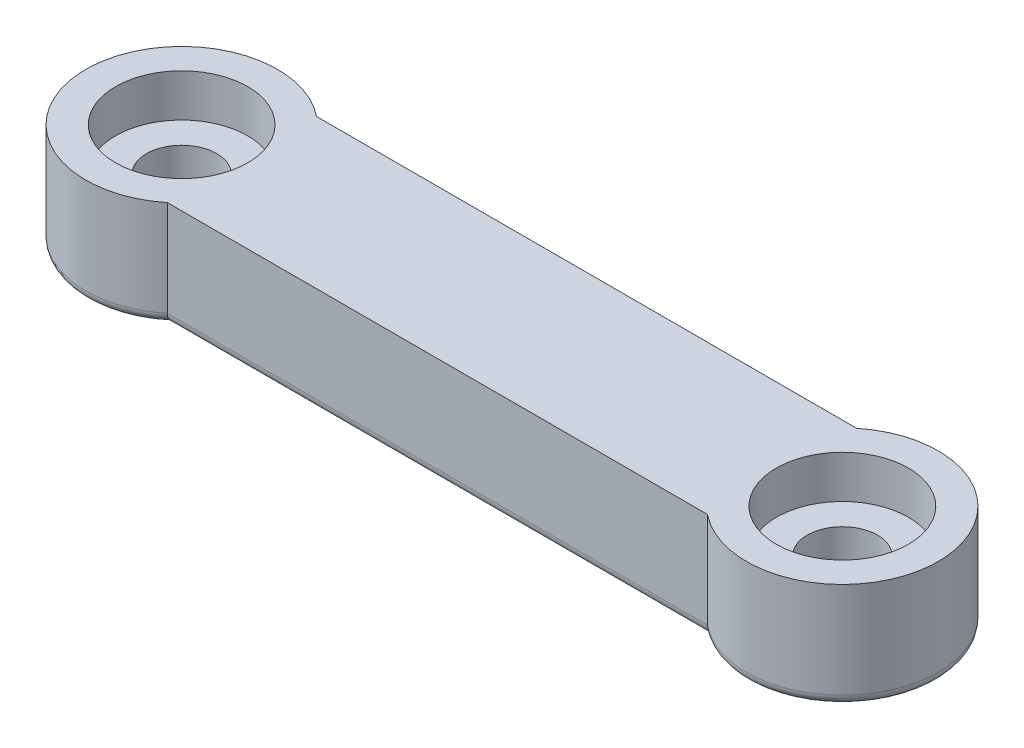
ISO-10303-21;
HEADER;
FILE_DESCRIPTION(('STEP AP214'),'2;1');
FILE_NAME('part.step','',(''),(''),'','','');
FILE_SCHEMA(('AUTOMOTIVE_DESIGN { 1 0 10303 214 1 1 1 1 }'));
ENDSEC;
DATA;
#1=APPLICATION_CONTEXT('core data for automotive mechanical design processes');
#2=APPLICATION_PROTOCOL_DEFINITION('international standard','automotive_design',2000,#1);
#3=PRODUCT_CONTEXT('',#1,'mechanical');
#4=PRODUCT('Part','Part','',(#3));
#5=PRODUCT_RELATED_PRODUCT_CATEGORY('part','',(#4));
#6=PRODUCT_DEFINITION_FORMATION('','',#4);
#7=PRODUCT_DEFINITION_CONTEXT('part definition',#1,'design');
#8=PRODUCT_DEFINITION('design','',#6,#7);
#9=PRODUCT_DEFINITION_SHAPE('','',#8);
#10=(LENGTH_UNIT() NAMED_UNIT(*) SI_UNIT(.MILLI.,.METRE.));
#11=(NAMED_UNIT(*) PLANE_ANGLE_UNIT() SI_UNIT($,.RADIAN.));
#12=(NAMED_UNIT(*) SI_UNIT($,.STERADIAN.) SOLID_ANGLE_UNIT());
#13=UNCERTAINTY_MEASURE_WITH_UNIT(LENGTH_MEASURE(1.E-05),#10,'distance_accuracy_value','');
#14=(GEOMETRIC_REPRESENTATION_CONTEXT(3) GLOBAL_UNCERTAINTY_ASSIGNED_CONTEXT((#13)) GLOBAL_UNIT_ASSIGNED_CONTEXT((#10,
#11,#12)) REPRESENTATION_CONTEXT('',''));
#15=CARTESIAN_POINT('',(0.,0.,0.));
#16=DIRECTION('',(0.,0.,1.));
#17=DIRECTION('',(1.,0.,0.));
#18=AXIS2_PLACEMENT_3D('',#15,#16,#17);
#19=CARTESIAN_POINT('',(31.,0.,-3.5));
#20=DIRECTION('',(0.,1.,0.));
#21=DIRECTION('',(0.,0.,1.));
#22=AXIS2_PLACEMENT_3D('',#19,#20,#21);
#23=CYLINDRICAL_SURFACE('',#22,1.65);
#24=CARTESIAN_POINT('',(31.,0.,-3.5));
#25=DIRECTION('',(0.,1.,0.));
#26=DIRECTION('',(0.,0.,1.));
#27=AXIS2_PLACEMENT_3D('',#24,#25,#26);
#28=CIRCLE('',#27,1.65);
#29=CARTESIAN_POINT('',(31.,0.,-1.85));
#30=VERTEX_POINT('',#29);
#31=EDGE_CURVE('E123',#30,#30,#28,.T.);
#32=ORIENTED_EDGE('',*,*,#31,.F.);
#33=EDGE_LOOP('',(#32));
#34=FACE_BOUND('',#33,.T.);
#35=CARTESIAN_POINT('',(31.,3.,-3.5));
#36=DIRECTION('',(0.,1.,0.));
#37=DIRECTION('',(0.,0.,1.));
#38=AXIS2_PLACEMENT_3D('',#35,#36,#37);
#39=CIRCLE('',#38,1.65);
#40=CARTESIAN_POINT('',(31.,3.,-1.85));
#41=VERTEX_POINT('',#40);
#42=EDGE_CURVE('E125',#41,#41,#39,.F.);
#43=ORIENTED_EDGE('',*,*,#42,.F.);
#44=EDGE_LOOP('',(#43));
#45=FACE_BOUND('',#44,.T.);
#46=ADVANCED_FACE('F34',(#34,#45),#23,.F.);
#47=CARTESIAN_POINT('',(0.,0.,-3.5));
#48=DIRECTION('',(0.,1.,0.));
#49=DIRECTION('',(0.,0.,1.));
#50=AXIS2_PLACEMENT_3D('',#47,#48,#49);
#51=CYLINDRICAL_SURFACE('',#50,1.65);
#52=CARTESIAN_POINT('',(0.,0.,-3.5));
#53=DIRECTION('',(0.,1.,0.));
#54=DIRECTION('',(0.,0.,1.));
#55=AXIS2_PLACEMENT_3D('',#52,#53,#54);
#56=CIRCLE('',#55,1.65);
#57=CARTESIAN_POINT('',(0.,0.,-1.85));
#58=VERTEX_POINT('',#57);
#59=EDGE_CURVE('E108',#58,#58,#56,.T.);
#60=ORIENTED_EDGE('',*,*,#59,.F.);
#61=EDGE_LOOP('',(#60));
#62=FACE_BOUND('',#61,.T.);
#63=CARTESIAN_POINT('',(0.,3.,-3.5));
#64=DIRECTION('',(0.,1.,0.));
#65=DIRECTION('',(0.,0.,1.));
#66=AXIS2_PLACEMENT_3D('',#63,#64,#65);
#67=CIRCLE('',#66,1.65);
#68=CARTESIAN_POINT('',(0.,3.,-1.85));
#69=VERTEX_POINT('',#68);
#70=EDGE_CURVE('E120',#69,#69,#67,.F.);
#71=ORIENTED_EDGE('',*,*,#70,.F.);
#72=EDGE_LOOP('',(#71));
#73=FACE_BOUND('',#72,.T.);
#74=ADVANCED_FACE('F234',(#62,#73),#51,.F.);
#75=CARTESIAN_POINT('',(0.,5.,0.));
#76=DIRECTION('',(0.,0.,-1.));
#77=DIRECTION('',(-1.,0.,0.));
#78=AXIS2_PLACEMENT_3D('',#75,#76,#77);
#79=PLANE('',#78);
#80=DIRECTION('',(0.,1.,0.));
#81=VECTOR('',#80,1.);
#82=CARTESIAN_POINT('',(2.82842712474619,0.,0.));
#83=LINE('',#82,#81);
#84=CARTESIAN_POINT('',(2.82842712474619,5.,0.));
#85=VERTEX_POINT('',#84);
#86=CARTESIAN_POINT('',(2.82842712474619,0.5,0.));
#87=VERTEX_POINT('',#86);
#88=EDGE_CURVE('E90',#85,#87,#83,.F.);
#89=ORIENTED_EDGE('',*,*,#88,.T.);
#90=DIRECTION('',(1.,0.,0.));
#91=VECTOR('',#90,1.);
#92=CARTESIAN_POINT('',(28.1715728752538,0.5,0.));
#93=LINE('',#92,#91);
#94=CARTESIAN_POINT('',(28.1715728752538,0.5,0.));
#95=VERTEX_POINT('',#94);
#96=EDGE_CURVE('E11',#87,#95,#93,.T.);
#97=ORIENTED_EDGE('',*,*,#96,.T.);
#98=DIRECTION('',(0.,1.,0.));
#99=VECTOR('',#98,1.);
#100=CARTESIAN_POINT('',(28.1715728752538,0.,0.));
#101=LINE('',#100,#99);
#102=CARTESIAN_POINT('',(28.1715728752538,5.,0.));
#103=VERTEX_POINT('',#102);
#104=EDGE_CURVE('E112',#95,#103,#101,.T.);
#105=ORIENTED_EDGE('',*,*,#104,.T.);
#106=DIRECTION('',(1.,0.,0.));
#107=VECTOR('',#106,1.);
#108=CARTESIAN_POINT('',(0.,5.,0.));
#109=LINE('',#108,#107);
#110=EDGE_CURVE('E104',#85,#103,#109,.T.);
#111=ORIENTED_EDGE('',*,*,#110,.F.);
#112=EDGE_LOOP('',(#89,#97,#105,#111));
#113=FACE_BOUND('',#112,.T.);
#114=ADVANCED_FACE('F110',(#113),#79,.F.);
#115=CARTESIAN_POINT('',(0.,5.,-7.));
#116=DIRECTION('',(0.,0.,1.));
#117=DIRECTION('',(1.,0.,0.));
#118=AXIS2_PLACEMENT_3D('',#115,#116,#117);
#119=PLANE('',#118);
#120=DIRECTION('',(0.,1.,0.));
#121=VECTOR('',#120,1.);
#122=CARTESIAN_POINT('',(28.1715728752538,0.,-7.));
#123=LINE('',#122,#121);
#124=CARTESIAN_POINT('',(28.1715728752538,5.,-7.));
#125=VERTEX_POINT('',#124);
#126=CARTESIAN_POINT('',(28.1715728752538,0.5,-7.));
#127=VERTEX_POINT('',#126);
#128=EDGE_CURVE('E116',#125,#127,#123,.F.);
#129=ORIENTED_EDGE('',*,*,#128,.T.);
#130=DIRECTION('',(-1.,0.,0.));
#131=VECTOR('',#130,1.);
#132=CARTESIAN_POINT('',(2.82842712474619,0.5,-7.));
#133=LINE('',#132,#131);
#134=CARTESIAN_POINT('',(2.82842712474619,0.5,-7.));
#135=VERTEX_POINT('',#134);
#136=EDGE_CURVE('E62',#127,#135,#133,.T.);
#137=ORIENTED_EDGE('',*,*,#136,.T.);
#138=DIRECTION('',(0.,1.,0.));
#139=VECTOR('',#138,1.);
#140=CARTESIAN_POINT('',(2.82842712474619,0.,-7.));
#141=LINE('',#140,#139);
#142=CARTESIAN_POINT('',(2.82842712474619,5.,-7.));
#143=VERTEX_POINT('',#142);
#144=EDGE_CURVE('E99',#135,#143,#141,.T.);
#145=ORIENTED_EDGE('',*,*,#144,.T.);
#146=DIRECTION('',(-1.,0.,0.));
#147=VECTOR('',#146,1.);
#148=CARTESIAN_POINT('',(0.,5.,-7.));
#149=LINE('',#148,#147);
#150=EDGE_CURVE('E107',#125,#143,#149,.T.);
#151=ORIENTED_EDGE('',*,*,#150,.F.);
#152=EDGE_LOOP('',(#129,#137,#145,#151));
#153=FACE_BOUND('',#152,.T.);
#154=ADVANCED_FACE('F188',(#153),#119,.F.);
#155=CARTESIAN_POINT('',(0.,5.,0.));
#156=DIRECTION('',(0.,-1.,0.));
#157=DIRECTION('',(0.,0.,-1.));
#158=AXIS2_PLACEMENT_3D('',#155,#156,#157);
#159=PLANE('',#158);
#160=CARTESIAN_POINT('',(31.,5.,-3.5));
#161=DIRECTION('',(0.,1.,0.));
#162=DIRECTION('',(0.,0.,1.));
#163=AXIS2_PLACEMENT_3D('',#160,#161,#162);
#164=CIRCLE('',#163,3.1);
#165=CARTESIAN_POINT('',(31.,5.,-0.399999999999998));
#166=VERTEX_POINT('',#165);
#167=EDGE_CURVE('E172',#166,#166,#164,.T.);
#168=ORIENTED_EDGE('',*,*,#167,.F.);
#169=EDGE_LOOP('',(#168));
#170=FACE_BOUND('',#169,.T.);
#171=CARTESIAN_POINT('',(0.,5.,-3.5));
#172=DIRECTION('',(0.,1.,0.));
#173=DIRECTION('',(0.,0.,1.));
#174=AXIS2_PLACEMENT_3D('',#171,#172,#173);
#175=CIRCLE('',#174,3.1);
#176=CARTESIAN_POINT('',(0.,5.,-0.4));
#177=VERTEX_POINT('',#176);
#178=EDGE_CURVE('E128',#177,#177,#175,.T.);
#179=ORIENTED_EDGE('',*,*,#178,.F.);
#180=EDGE_LOOP('',(#179));
#181=FACE_BOUND('',#180,.T.);
#182=CARTESIAN_POINT('',(0.,5.,-3.5));
#183=DIRECTION('',(0.,1.,0.));
#184=DIRECTION('',(0.,0.,1.));
#185=AXIS2_PLACEMENT_3D('',#182,#183,#184);
#186=CIRCLE('',#185,4.5);
#187=EDGE_CURVE('E93',#143,#85,#186,.T.);
#188=ORIENTED_EDGE('',*,*,#187,.T.);
#189=ORIENTED_EDGE('',*,*,#110,.T.);
#190=CARTESIAN_POINT('',(31.,5.,-3.5));
#191=DIRECTION('',(0.,1.,0.));
#192=DIRECTION('',(0.,0.,1.));
#193=AXIS2_PLACEMENT_3D('',#190,#191,#192);
#194=CIRCLE('',#193,4.5);
#195=EDGE_CURVE('E98',#103,#125,#194,.T.);
#196=ORIENTED_EDGE('',*,*,#195,.T.);
#197=ORIENTED_EDGE('',*,*,#150,.T.);
#198=EDGE_LOOP('',(#188,#189,#196,#197));
#199=FACE_BOUND('',#198,.T.);
#200=ADVANCED_FACE('F103',(#170,#181,#199),#159,.F.);
#201=CARTESIAN_POINT('',(0.,0.,0.));
#202=DIRECTION('',(0.,-1.,0.));
#203=DIRECTION('',(0.,0.,-1.));
#204=AXIS2_PLACEMENT_3D('',#201,#202,#203);
#205=PLANE('',#204);
#206=DIRECTION('',(-1.,0.,0.));
#207=VECTOR('',#206,1.);
#208=CARTESIAN_POINT('',(28.1715728752538,0.,-6.5));
#209=LINE('',#208,#207);
#210=CARTESIAN_POINT('',(2.6457513110654,0.,-6.49999999999928));
#211=VERTEX_POINT('',#210);
#212=CARTESIAN_POINT('',(28.3542486889346,0.,-6.5));
#213=VERTEX_POINT('',#212);
#214=EDGE_CURVE('E136',#211,#213,#209,.F.);
#215=ORIENTED_EDGE('',*,*,#214,.T.);
#216=CARTESIAN_POINT('',(31.,0.,-3.5));
#217=DIRECTION('',(0.,-1.,0.));
#218=DIRECTION('',(0.,0.,-1.));
#219=AXIS2_PLACEMENT_3D('',#216,#217,#218);
#220=CIRCLE('',#219,4.);
#221=CARTESIAN_POINT('',(28.3542486889346,0.,-0.5));
#222=VERTEX_POINT('',#221);
#223=EDGE_CURVE('E138',#213,#222,#220,.T.);
#224=ORIENTED_EDGE('',*,*,#223,.T.);
#225=DIRECTION('',(1.,0.,0.));
#226=VECTOR('',#225,1.);
#227=CARTESIAN_POINT('',(2.82842712474619,0.,-0.5));
#228=LINE('',#227,#226);
#229=CARTESIAN_POINT('',(2.6457513110654,0.,-0.5));
#230=VERTEX_POINT('',#229);
#231=EDGE_CURVE('E132',#222,#230,#228,.F.);
#232=ORIENTED_EDGE('',*,*,#231,.T.);
#233=CARTESIAN_POINT('',(0.,0.,-3.5));
#234=DIRECTION('',(0.,-1.,0.));
#235=DIRECTION('',(0.,0.,-1.));
#236=AXIS2_PLACEMENT_3D('',#233,#234,#235);
#237=CIRCLE('',#236,4.);
#238=EDGE_CURVE('E134',#230,#211,#237,.T.);
#239=ORIENTED_EDGE('',*,*,#238,.T.);
#240=EDGE_LOOP('',(#215,#224,#232,#239));
#241=FACE_BOUND('',#240,.T.);
#242=ORIENTED_EDGE('',*,*,#31,.T.);
#243=EDGE_LOOP('',(#242));
#244=FACE_BOUND('',#243,.T.);
#245=ORIENTED_EDGE('',*,*,#59,.T.);
#246=EDGE_LOOP('',(#245));
#247=FACE_BOUND('',#246,.T.);
#248=ADVANCED_FACE('F183',(#241,#244,#247),#205,.T.);
#249=CARTESIAN_POINT('',(31.,0.,-3.5));
#250=DIRECTION('',(0.,1.,0.));
#251=DIRECTION('',(0.,0.,1.));
#252=AXIS2_PLACEMENT_3D('',#249,#250,#251);
#253=CYLINDRICAL_SURFACE('',#252,4.5);
#254=ORIENTED_EDGE('',*,*,#104,.F.);
#255=CARTESIAN_POINT('',(31.,0.5,-3.5));
#256=DIRECTION('',(0.,-1.,0.));
#257=DIRECTION('',(0.,0.,-1.));
#258=AXIS2_PLACEMENT_3D('',#255,#256,#257);
#259=CIRCLE('',#258,4.5);
#260=EDGE_CURVE('E114',#95,#127,#259,.F.);
#261=ORIENTED_EDGE('',*,*,#260,.T.);
#262=ORIENTED_EDGE('',*,*,#128,.F.);
#263=ORIENTED_EDGE('',*,*,#195,.F.);
#264=EDGE_LOOP('',(#254,#261,#262,#263));
#265=FACE_BOUND('',#264,.T.);
#266=ADVANCED_FACE('F187',(#265),#253,.T.);
#267=CARTESIAN_POINT('',(0.,0.,-3.5));
#268=DIRECTION('',(0.,1.,0.));
#269=DIRECTION('',(0.,0.,1.));
#270=AXIS2_PLACEMENT_3D('',#267,#268,#269);
#271=CYLINDRICAL_SURFACE('',#270,4.5);
#272=ORIENTED_EDGE('',*,*,#144,.F.);
#273=CARTESIAN_POINT('',(0.,0.5,-3.5));
#274=DIRECTION('',(0.,-1.,0.));
#275=DIRECTION('',(0.,0.,-1.));
#276=AXIS2_PLACEMENT_3D('',#273,#274,#275);
#277=CIRCLE('',#276,4.5);
#278=EDGE_CURVE('E47',#135,#87,#277,.F.);
#279=ORIENTED_EDGE('',*,*,#278,.T.);
#280=ORIENTED_EDGE('',*,*,#88,.F.);
#281=ORIENTED_EDGE('',*,*,#187,.F.);
#282=EDGE_LOOP('',(#272,#279,#280,#281));
#283=FACE_BOUND('',#282,.T.);
#284=ADVANCED_FACE('F92',(#283),#271,.T.);
#285=CARTESIAN_POINT('',(0.,3.,-3.5));
#286=DIRECTION('',(0.,1.,0.));
#287=DIRECTION('',(0.,0.,1.));
#288=AXIS2_PLACEMENT_3D('',#285,#286,#287);
#289=PLANE('',#288);
#290=CARTESIAN_POINT('',(0.,3.,-3.5));
#291=DIRECTION('',(0.,1.,0.));
#292=DIRECTION('',(0.,0.,1.));
#293=AXIS2_PLACEMENT_3D('',#290,#291,#292);
#294=CIRCLE('',#293,3.1);
#295=CARTESIAN_POINT('',(0.,3.,-0.4));
#296=VERTEX_POINT('',#295);
#297=EDGE_CURVE('E124',#296,#296,#294,.T.);
#298=ORIENTED_EDGE('',*,*,#297,.T.);
#299=EDGE_LOOP('',(#298));
#300=FACE_BOUND('',#299,.T.);
#301=ORIENTED_EDGE('',*,*,#70,.T.);
#302=EDGE_LOOP('',(#301));
#303=FACE_BOUND('',#302,.T.);
#304=ADVANCED_FACE('F221',(#300,#303),#289,.T.);
#305=CARTESIAN_POINT('',(0.,3.,-3.5));
#306=DIRECTION('',(0.,1.,0.));
#307=DIRECTION('',(0.,0.,1.));
#308=AXIS2_PLACEMENT_3D('',#305,#306,#307);
#309=CYLINDRICAL_SURFACE('',#308,3.1);
#310=ORIENTED_EDGE('',*,*,#297,.F.);
#311=EDGE_LOOP('',(#310));
#312=FACE_BOUND('',#311,.T.);
#313=ORIENTED_EDGE('',*,*,#178,.T.);
#314=EDGE_LOOP('',(#313));
#315=FACE_BOUND('',#314,.T.);
#316=ADVANCED_FACE('F219',(#312,#315),#309,.F.);
#317=CARTESIAN_POINT('',(31.,3.,-3.5));
#318=DIRECTION('',(0.,1.,0.));
#319=DIRECTION('',(0.,0.,1.));
#320=AXIS2_PLACEMENT_3D('',#317,#318,#319);
#321=PLANE('',#320);
#322=CARTESIAN_POINT('',(31.,3.,-3.5));
#323=DIRECTION('',(0.,1.,0.));
#324=DIRECTION('',(0.,0.,1.));
#325=AXIS2_PLACEMENT_3D('',#322,#323,#324);
#326=CIRCLE('',#325,3.1);
#327=CARTESIAN_POINT('',(31.,3.,-0.399999999999998));
#328=VERTEX_POINT('',#327);
#329=EDGE_CURVE('E129',#328,#328,#326,.T.);
#330=ORIENTED_EDGE('',*,*,#329,.T.);
#331=EDGE_LOOP('',(#330));
#332=FACE_BOUND('',#331,.T.);
#333=ORIENTED_EDGE('',*,*,#42,.T.);
#334=EDGE_LOOP('',(#333));
#335=FACE_BOUND('',#334,.T.);
#336=ADVANCED_FACE('F205',(#332,#335),#321,.T.);
#337=CARTESIAN_POINT('',(31.,3.,-3.5));
#338=DIRECTION('',(0.,1.,0.));
#339=DIRECTION('',(0.,0.,1.));
#340=AXIS2_PLACEMENT_3D('',#337,#338,#339);
#341=CYLINDRICAL_SURFACE('',#340,3.1);
#342=ORIENTED_EDGE('',*,*,#329,.F.);
#343=EDGE_LOOP('',(#342));
#344=FACE_BOUND('',#343,.T.);
#345=ORIENTED_EDGE('',*,*,#167,.T.);
#346=EDGE_LOOP('',(#345));
#347=FACE_BOUND('',#346,.T.);
#348=ADVANCED_FACE('F208',(#344,#347),#341,.F.);
#349=CARTESIAN_POINT('',(0.,0.5,-3.5));
#350=DIRECTION('',(0.,-1.,0.));
#351=DIRECTION('',(0.,0.,-1.));
#352=AXIS2_PLACEMENT_3D('',#349,#350,#351);
#353=TOROIDAL_SURFACE('',#352,4.,0.5);
#354=CARTESIAN_POINT('',(2.82842712474619,0.5,-7.));
#355=CARTESIAN_POINT('',(2.82843602799302,0.473049536404365,-7.00002868294445));
#356=CARTESIAN_POINT('',(2.8276574089572,0.446115084682407,-6.99782295534803));
#357=CARTESIAN_POINT('',(2.8245942402374,0.393085795099896,-6.98916421891165));
#358=CARTESIAN_POINT('',(2.82231308711431,0.366989202429285,-6.98272078967865));
#359=CARTESIAN_POINT('',(2.81631357602138,0.316316504852455,-6.96580687186099));
#360=CARTESIAN_POINT('',(2.81259529955809,0.291740313808231,-6.9553366116585));
#361=CARTESIAN_POINT('',(2.80384040511152,0.244741690234721,-6.93075089381794));
#362=CARTESIAN_POINT('',(2.79880351482553,0.222319703872226,-6.91663468327445));
#363=CARTESIAN_POINT('',(2.78742766966984,0.179678117229886,-6.88486002566356));
#364=CARTESIAN_POINT('',(2.78106140392219,0.1595211174005,-6.86712749920604));
#365=CARTESIAN_POINT('',(2.76727851511785,0.122455483556791,-6.82889146510103));
#366=CARTESIAN_POINT('',(2.75986154758605,0.10554791917913,-6.80838704878397));
#367=CARTESIAN_POINT('',(2.74373995270562,0.0744814010452313,-6.76402027642532));
#368=CARTESIAN_POINT('',(2.73498724818534,0.0605217970409316,-6.74003598010742));
#369=CARTESIAN_POINT('',(2.71675002597386,0.0368207820131519,-6.69032384652976));
#370=CARTESIAN_POINT('',(2.70726542771733,0.027079836153359,-6.66459581736159));
#371=CARTESIAN_POINT('',(2.68947531477602,0.0132602486706095,-6.61660616410762));
#372=CARTESIAN_POINT('',(2.68124732453821,0.00849616175480383,-6.59450877024797));
#373=CARTESIAN_POINT('',(2.66458823772384,0.00199749708245064,-6.5499806942288));
#374=CARTESIAN_POINT('',(2.65615755215858,0.000257239524026848,-6.52755071691309));
#375=CARTESIAN_POINT('',(2.64704715811007,8.79896774300487E-06,-6.50342911469581));
#376=CARTESIAN_POINT('',(2.64639931120109,-2.17634650854478E-08,-6.50171444237487));
#377=CARTESIAN_POINT('',(2.64575131106459,0.,-6.5));
#378=B_SPLINE_CURVE_WITH_KNOTS('',3,(#354,#355,#356,#357,#358,#359,#360,#361,#362,#363,#364,
#365,#366,#367,#368,#369,#370,#371,#372,#373,#374,#375,#376,#377),.UNSPECIFIED.,.F.,.F.,(4,2,2,
2,2,2,2,2,2,2,2,4),(0.,0.0807254543750162,0.161269047839428,0.241808073938378,0.322363745030777,
0.404774297128624,0.487211930525085,0.57413039313318,0.661058437229921,0.733045942168927,
0.804898082802622,0.810396978914769),.UNSPECIFIED.);
#379=EDGE_CURVE('E164',#211,#135,#378,.F.);
#380=ORIENTED_EDGE('',*,*,#379,.F.);
#381=ORIENTED_EDGE('',*,*,#238,.F.);
#382=CARTESIAN_POINT('',(2.82842712474619,0.5,0.));
#383=CARTESIAN_POINT('',(2.82843602799302,0.473049536404365,2.86829444501018E-05));
#384=CARTESIAN_POINT('',(2.8276574089572,0.446115084682407,-0.0021770446519677));
#385=CARTESIAN_POINT('',(2.8245942402374,0.393085795099896,-0.0108357810883533));
#386=CARTESIAN_POINT('',(2.82231308711431,0.366989202429286,-0.0172792103213454));
#387=CARTESIAN_POINT('',(2.81631357602138,0.316316504852455,-0.034193128139006));
#388=CARTESIAN_POINT('',(2.81259529955809,0.291740313808231,-0.0446633883415046));
#389=CARTESIAN_POINT('',(2.80384040511152,0.244741690234721,-0.0692491061820648));
#390=CARTESIAN_POINT('',(2.79880351482553,0.222319703872227,-0.0833653167255496));
#391=CARTESIAN_POINT('',(2.78742766966984,0.179678117229886,-0.115139974336437));
#392=CARTESIAN_POINT('',(2.78106140392219,0.1595211174005,-0.132872500793958));
#393=CARTESIAN_POINT('',(2.76727851511785,0.122455483556791,-0.171108534898966));
#394=CARTESIAN_POINT('',(2.75986154758606,0.10554791917913,-0.191612951216035));
#395=CARTESIAN_POINT('',(2.74373995270562,0.0744814010452313,-0.235979723574679));
#396=CARTESIAN_POINT('',(2.73498724818534,0.0605217970409318,-0.259964019892585));
#397=CARTESIAN_POINT('',(2.71675002597386,0.036820782013152,-0.309676153470239));
#398=CARTESIAN_POINT('',(2.70726542771733,0.027079836153359,-0.335404182638409));
#399=CARTESIAN_POINT('',(2.68947531477602,0.0132602486706095,-0.383393835892381));
#400=CARTESIAN_POINT('',(2.68124732453822,0.0084961617548038,-0.405491229752035));
#401=CARTESIAN_POINT('',(2.66458823772384,0.00199749708245047,-0.450019305771202));
#402=CARTESIAN_POINT('',(2.65615755215858,0.000257239524026551,-0.472449283086906));
#403=CARTESIAN_POINT('',(2.64704715811007,8.79896774296242E-06,-0.496570885304187));
#404=CARTESIAN_POINT('',(2.64639931120109,-2.17634651077196E-08,-0.498285557625131));
#405=CARTESIAN_POINT('',(2.64575131106459,0.,-0.5));
#406=B_SPLINE_CURVE_WITH_KNOTS('',3,(#382,#383,#384,#385,#386,#387,#388,#389,#390,#391,#392,
#393,#394,#395,#396,#397,#398,#399,#400,#401,#402,#403,#404,#405),.UNSPECIFIED.,.F.,.F.,(4,2,2,
2,2,2,2,2,2,2,2,4),(0.,0.0807254543750162,0.161269047839428,0.241808073938378,0.322363745030777,
0.404774297128624,0.487211930525085,0.574130393133179,0.661058437229921,0.733045942168927,
0.804898082802622,0.810396978914769),.UNSPECIFIED.);
#407=EDGE_CURVE('E39',#87,#230,#406,.T.);
#408=ORIENTED_EDGE('',*,*,#407,.F.);
#409=ORIENTED_EDGE('',*,*,#278,.F.);
#410=EDGE_LOOP('',(#380,#381,#408,#409));
#411=FACE_BOUND('',#410,.T.);
#412=ADVANCED_FACE('F36',(#411),#353,.T.);
#413=CARTESIAN_POINT('',(0.,0.5,-0.5));
#414=DIRECTION('',(-1.,0.,0.));
#415=DIRECTION('',(0.,0.,1.));
#416=AXIS2_PLACEMENT_3D('',#413,#414,#415);
#417=CYLINDRICAL_SURFACE('',#416,0.5);
#418=ORIENTED_EDGE('',*,*,#407,.T.);
#419=ORIENTED_EDGE('',*,*,#231,.F.);
#420=CARTESIAN_POINT('',(28.1715728752538,0.5,0.));
#421=CARTESIAN_POINT('',(28.171563972007,0.473049536404365,2.86829444499853E-05));
#422=CARTESIAN_POINT('',(28.1723425910428,0.446115084682407,-0.00217704465196784));
#423=CARTESIAN_POINT('',(28.1754057597626,0.393085795099895,-0.0108357810883534));
#424=CARTESIAN_POINT('',(28.1776869128857,0.366989202429285,-0.0172792103213455));
#425=CARTESIAN_POINT('',(28.1836864239786,0.316316504852454,-0.034193128139006));
#426=CARTESIAN_POINT('',(28.1874047004419,0.291740313808231,-0.0446633883415048));
#427=CARTESIAN_POINT('',(28.1961595948885,0.244741690234721,-0.069249106182065));
#428=CARTESIAN_POINT('',(28.2011964851745,0.222319703872226,-0.0833653167255497));
#429=CARTESIAN_POINT('',(28.2125723303302,0.179678117229885,-0.115139974336437));
#430=CARTESIAN_POINT('',(28.2189385960778,0.1595211174005,-0.132872500793958));
#431=CARTESIAN_POINT('',(28.2327214848821,0.12245548355679,-0.171108534898967));
#432=CARTESIAN_POINT('',(28.2401384524139,0.105547919179129,-0.191612951216035));
#433=CARTESIAN_POINT('',(28.2562600472944,0.0744814010452313,-0.235979723574679));
#434=CARTESIAN_POINT('',(28.2650127518147,0.0605217970409318,-0.259964019892585));
#435=CARTESIAN_POINT('',(28.2832499740261,0.0368207820131519,-0.30967615347024));
#436=CARTESIAN_POINT('',(28.2927345722827,0.0270798361533588,-0.335404182638412));
#437=CARTESIAN_POINT('',(28.310524685224,0.0132602486706092,-0.38339383589238));
#438=CARTESIAN_POINT('',(28.3187526754618,0.00849616175480352,-0.40549122975203));
#439=CARTESIAN_POINT('',(28.3354117622761,0.0019974970824503,-0.45001930577121));
#440=CARTESIAN_POINT('',(28.3438424478414,0.000257239524026353,-0.472449283086933));
#441=CARTESIAN_POINT('',(28.3529528418899,8.79896774293987E-06,-0.496570885304192));
#442=CARTESIAN_POINT('',(28.3536006887989,-2.176346511703E-08,-0.498285557625134));
#443=CARTESIAN_POINT('',(28.3542486889354,0.,-0.5));
#444=B_SPLINE_CURVE_WITH_KNOTS('',3,(#420,#421,#422,#423,#424,#425,#426,#427,#428,#429,#430,
#431,#432,#433,#434,#435,#436,#437,#438,#439,#440,#441,#442,#443),.UNSPECIFIED.,.F.,.F.,(4,2,2,
2,2,2,2,2,2,2,2,4),(0.,0.0807254543750164,0.161269047839428,0.241808073938379,0.322363745030777,
0.404774297128625,0.487211930525085,0.57413039313318,0.661058437229922,0.73304594216893,
0.804898082802623,0.810396978914768),.UNSPECIFIED.);
#445=EDGE_CURVE('E150',#95,#222,#444,.T.);
#446=ORIENTED_EDGE('',*,*,#445,.F.);
#447=ORIENTED_EDGE('',*,*,#96,.F.);
#448=EDGE_LOOP('',(#418,#419,#446,#447));
#449=FACE_BOUND('',#448,.T.);
#450=ADVANCED_FACE('F160',(#449),#417,.T.);
#451=CARTESIAN_POINT('',(0.,0.5,-6.5));
#452=DIRECTION('',(1.,0.,0.));
#453=DIRECTION('',(0.,0.,-1.));
#454=AXIS2_PLACEMENT_3D('',#451,#452,#453);
#455=CYLINDRICAL_SURFACE('',#454,0.5);
#456=ORIENTED_EDGE('',*,*,#379,.T.);
#457=ORIENTED_EDGE('',*,*,#136,.F.);
#458=CARTESIAN_POINT('',(28.1715728752538,0.5,-7.));
#459=CARTESIAN_POINT('',(28.171563972007,0.473049536404365,-7.00002868294445));
#460=CARTESIAN_POINT('',(28.1723425910428,0.446115084682408,-6.99782295534803));
#461=CARTESIAN_POINT('',(28.1754057597626,0.393085795099896,-6.98916421891165));
#462=CARTESIAN_POINT('',(28.1776869128857,0.366989202429286,-6.98272078967866));
#463=CARTESIAN_POINT('',(28.1836864239786,0.316316504852455,-6.96580687186099));
#464=CARTESIAN_POINT('',(28.1874047004419,0.291740313808231,-6.9553366116585));
#465=CARTESIAN_POINT('',(28.1961595948885,0.244741690234721,-6.93075089381794));
#466=CARTESIAN_POINT('',(28.2011964851745,0.222319703872226,-6.91663468327445));
#467=CARTESIAN_POINT('',(28.2125723303302,0.179678117229886,-6.88486002566356));
#468=CARTESIAN_POINT('',(28.2189385960778,0.1595211174005,-6.86712749920604));
#469=CARTESIAN_POINT('',(28.2327214848821,0.122455483556791,-6.82889146510103));
#470=CARTESIAN_POINT('',(28.2401384524139,0.10554791917913,-6.80838704878397));
#471=CARTESIAN_POINT('',(28.2562600472944,0.0744814010452317,-6.76402027642532));
#472=CARTESIAN_POINT('',(28.2650127518147,0.0605217970409323,-6.74003598010742));
#473=CARTESIAN_POINT('',(28.2832499740261,0.0368207820131524,-6.69032384652976));
#474=CARTESIAN_POINT('',(28.2927345722827,0.0270798361533592,-6.66459581736159));
#475=CARTESIAN_POINT('',(28.310524685224,0.0132602486706096,-6.61660616410762));
#476=CARTESIAN_POINT('',(28.3187526754618,0.00849616175480391,-6.59450877024797));
#477=CARTESIAN_POINT('',(28.3354117622761,0.00199749708245037,-6.5499806942288));
#478=CARTESIAN_POINT('',(28.3438424478414,0.000257239524026343,-6.52755071691308));
#479=CARTESIAN_POINT('',(28.3529528418899,8.79896774293632E-06,-6.50342911469581));
#480=CARTESIAN_POINT('',(28.3536006887989,-2.17634651195514E-08,-6.50171444237487));
#481=CARTESIAN_POINT('',(28.3542486889354,0.,-6.5));
#482=B_SPLINE_CURVE_WITH_KNOTS('',3,(#458,#459,#460,#461,#462,#463,#464,#465,#466,#467,#468,
#469,#470,#471,#472,#473,#474,#475,#476,#477,#478,#479,#480,#481),.UNSPECIFIED.,.F.,.F.,(4,2,2,
2,2,2,2,2,2,2,2,4),(0.,0.080725454375016,0.161269047839428,0.241808073938379,0.322363745030776,
0.404774297128624,0.487211930525083,0.574130393133178,0.661058437229921,0.733045942168927,
0.804898082802623,0.810396978914768),.UNSPECIFIED.);
#483=EDGE_CURVE('E143',#213,#127,#482,.F.);
#484=ORIENTED_EDGE('',*,*,#483,.F.);
#485=ORIENTED_EDGE('',*,*,#214,.F.);
#486=EDGE_LOOP('',(#456,#457,#484,#485));
#487=FACE_BOUND('',#486,.T.);
#488=ADVANCED_FACE('F157',(#487),#455,.T.);
#489=CARTESIAN_POINT('',(31.,0.5,-3.5));
#490=DIRECTION('',(0.,-1.,0.));
#491=DIRECTION('',(0.,0.,-1.));
#492=AXIS2_PLACEMENT_3D('',#489,#490,#491);
#493=TOROIDAL_SURFACE('',#492,4.,0.5);
#494=ORIENTED_EDGE('',*,*,#445,.T.);
#495=ORIENTED_EDGE('',*,*,#223,.F.);
#496=ORIENTED_EDGE('',*,*,#483,.T.);
#497=ORIENTED_EDGE('',*,*,#260,.F.);
#498=EDGE_LOOP('',(#494,#495,#496,#497));
#499=FACE_BOUND('',#498,.T.);
#500=ADVANCED_FACE('F154',(#499),#493,.T.);
#501=CLOSED_SHELL('',(#46,#74,#114,#154,#200,#248,#266,#284,#304,#316,#336,#348,#412,#450,#488,#500));
#502=MANIFOLD_SOLID_BREP('B2',#501);
#503=ADVANCED_BREP_SHAPE_REPRESENTATION('',(#18,#502),#14);
#504=SHAPE_DEFINITION_REPRESENTATION(#9,#503);
ENDSEC;
END-ISO-10303-21;
